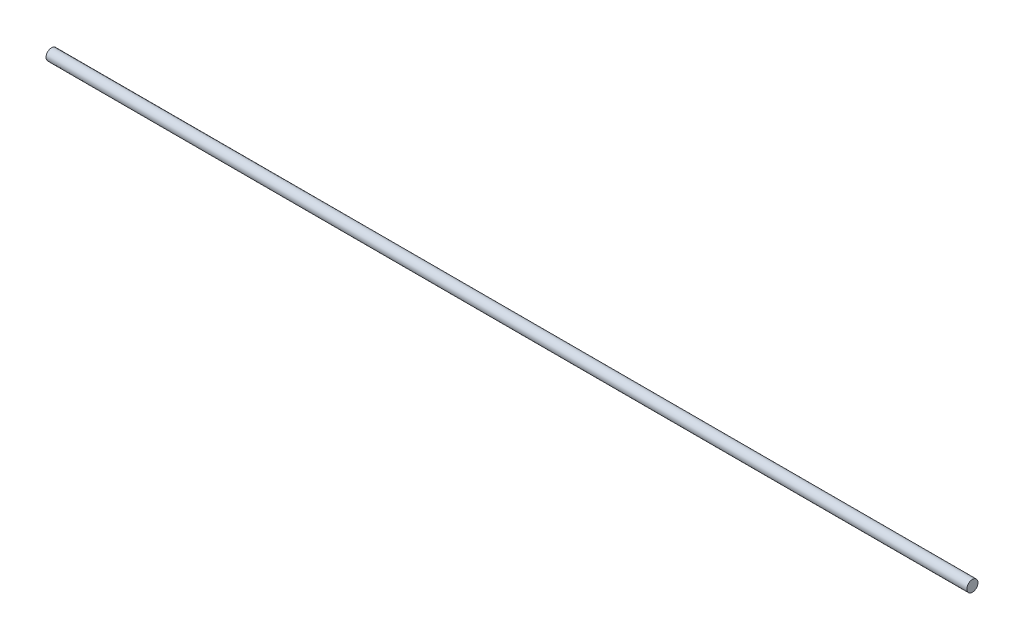
ISO-10303-21;
HEADER;
FILE_DESCRIPTION(('STEP AP214'),'2;1');
FILE_NAME('part.step','',(''),(''),'','','');
FILE_SCHEMA(('AUTOMOTIVE_DESIGN { 1 0 10303 214 1 1 1 1 }'));
ENDSEC;
DATA;
#1=APPLICATION_CONTEXT('core data for automotive mechanical design processes');
#2=APPLICATION_PROTOCOL_DEFINITION('international standard','automotive_design',2000,#1);
#3=PRODUCT_CONTEXT('',#1,'mechanical');
#4=PRODUCT('Part','Part','',(#3));
#5=PRODUCT_RELATED_PRODUCT_CATEGORY('part','',(#4));
#6=PRODUCT_DEFINITION_FORMATION('','',#4);
#7=PRODUCT_DEFINITION_CONTEXT('part definition',#1,'design');
#8=PRODUCT_DEFINITION('design','',#6,#7);
#9=PRODUCT_DEFINITION_SHAPE('','',#8);
#10=(LENGTH_UNIT() NAMED_UNIT(*) SI_UNIT(.MILLI.,.METRE.));
#11=(NAMED_UNIT(*) PLANE_ANGLE_UNIT() SI_UNIT($,.RADIAN.));
#12=(NAMED_UNIT(*) SI_UNIT($,.STERADIAN.) SOLID_ANGLE_UNIT());
#13=UNCERTAINTY_MEASURE_WITH_UNIT(LENGTH_MEASURE(1.E-05),#10,'distance_accuracy_value','');
#14=(GEOMETRIC_REPRESENTATION_CONTEXT(3) GLOBAL_UNCERTAINTY_ASSIGNED_CONTEXT((#13)) GLOBAL_UNIT_ASSIGNED_CONTEXT((#10,
#11,#12)) REPRESENTATION_CONTEXT('',''));
#15=CARTESIAN_POINT('',(0.,0.,0.));
#16=DIRECTION('',(0.,0.,1.));
#17=DIRECTION('',(1.,0.,0.));
#18=AXIS2_PLACEMENT_3D('',#15,#16,#17);
#19=CARTESIAN_POINT('',(-82.5,0.,0.));
#20=DIRECTION('',(1.,0.,0.));
#21=DIRECTION('',(0.,0.,-1.));
#22=AXIS2_PLACEMENT_3D('',#19,#20,#21);
#23=CYLINDRICAL_SURFACE('',#22,1.);
#24=CARTESIAN_POINT('',(-82.5,0.,0.));
#25=DIRECTION('',(1.,0.,0.));
#26=DIRECTION('',(0.,0.,-1.));
#27=AXIS2_PLACEMENT_3D('',#24,#25,#26);
#28=CIRCLE('',#27,1.);
#29=CARTESIAN_POINT('',(-82.5,0.,-1.));
#30=VERTEX_POINT('',#29);
#31=EDGE_CURVE('E10',#30,#30,#28,.T.);
#32=ORIENTED_EDGE('',*,*,#31,.T.);
#33=EDGE_LOOP('',(#32));
#34=FACE_BOUND('',#33,.T.);
#35=CARTESIAN_POINT('',(82.5,0.,0.));
#36=DIRECTION('',(1.,0.,0.));
#37=DIRECTION('',(0.,0.,-1.));
#38=AXIS2_PLACEMENT_3D('',#35,#36,#37);
#39=CIRCLE('',#38,1.);
#40=CARTESIAN_POINT('',(82.5,0.,-1.));
#41=VERTEX_POINT('',#40);
#42=EDGE_CURVE('E36',#41,#41,#39,.T.);
#43=ORIENTED_EDGE('',*,*,#42,.F.);
#44=EDGE_LOOP('',(#43));
#45=FACE_BOUND('',#44,.T.);
#46=ADVANCED_FACE('F30',(#34,#45),#23,.T.);
#47=CARTESIAN_POINT('',(-82.5,0.,0.));
#48=DIRECTION('',(1.,0.,0.));
#49=DIRECTION('',(0.,0.,-1.));
#50=AXIS2_PLACEMENT_3D('',#47,#48,#49);
#51=PLANE('',#50);
#52=ORIENTED_EDGE('',*,*,#31,.F.);
#53=EDGE_LOOP('',(#52));
#54=FACE_BOUND('',#53,.T.);
#55=ADVANCED_FACE('F45',(#54),#51,.F.);
#56=CARTESIAN_POINT('',(82.5,0.,0.));
#57=DIRECTION('',(1.,0.,0.));
#58=DIRECTION('',(0.,0.,-1.));
#59=AXIS2_PLACEMENT_3D('',#56,#57,#58);
#60=PLANE('',#59);
#61=ORIENTED_EDGE('',*,*,#42,.T.);
#62=EDGE_LOOP('',(#61));
#63=FACE_BOUND('',#62,.T.);
#64=ADVANCED_FACE('F42',(#63),#60,.T.);
#65=CLOSED_SHELL('',(#46,#55,#64));
#66=MANIFOLD_SOLID_BREP('B2',#65);
#67=ADVANCED_BREP_SHAPE_REPRESENTATION('',(#18,#66),#14);
#68=SHAPE_DEFINITION_REPRESENTATION(#9,#67);
ENDSEC;
END-ISO-10303-21;
